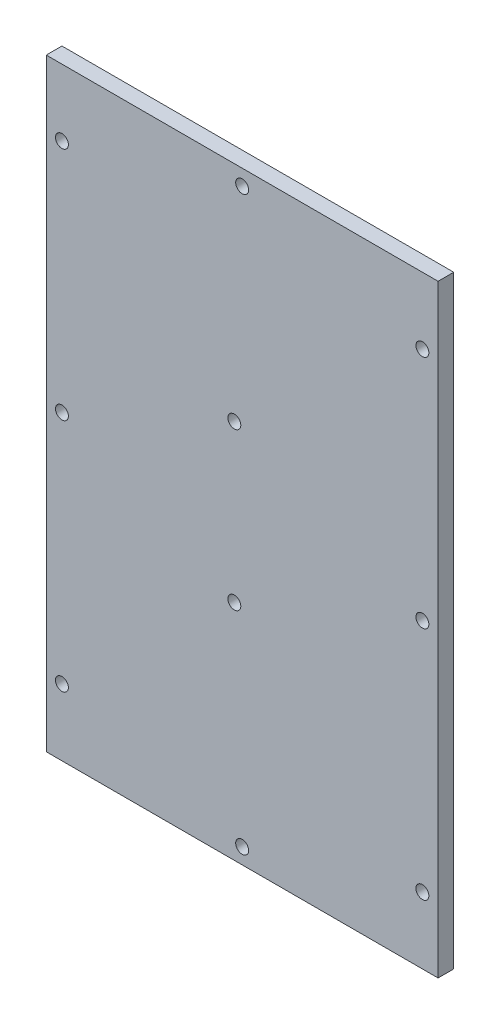
ISO-10303-21;
HEADER;
FILE_DESCRIPTION(('STEP AP214'),'2;1');
FILE_NAME('part.step','',(''),(''),'','','');
FILE_SCHEMA(('AUTOMOTIVE_DESIGN { 1 0 10303 214 1 1 1 1 }'));
ENDSEC;
DATA;
#1=APPLICATION_CONTEXT('core data for automotive mechanical design processes');
#2=APPLICATION_PROTOCOL_DEFINITION('international standard','automotive_design',2000,#1);
#3=PRODUCT_CONTEXT('',#1,'mechanical');
#4=PRODUCT('Part','Part','',(#3));
#5=PRODUCT_RELATED_PRODUCT_CATEGORY('part','',(#4));
#6=PRODUCT_DEFINITION_FORMATION('','',#4);
#7=PRODUCT_DEFINITION_CONTEXT('part definition',#1,'design');
#8=PRODUCT_DEFINITION('design','',#6,#7);
#9=PRODUCT_DEFINITION_SHAPE('','',#8);
#10=(LENGTH_UNIT() NAMED_UNIT(*) SI_UNIT(.MILLI.,.METRE.));
#11=(NAMED_UNIT(*) PLANE_ANGLE_UNIT() SI_UNIT($,.RADIAN.));
#12=(NAMED_UNIT(*) SI_UNIT($,.STERADIAN.) SOLID_ANGLE_UNIT());
#13=UNCERTAINTY_MEASURE_WITH_UNIT(LENGTH_MEASURE(1.E-05),#10,'distance_accuracy_value','');
#14=(GEOMETRIC_REPRESENTATION_CONTEXT(3) GLOBAL_UNCERTAINTY_ASSIGNED_CONTEXT((#13)) GLOBAL_UNIT_ASSIGNED_CONTEXT((#10,
#11,#12)) REPRESENTATION_CONTEXT('',''));
#15=CARTESIAN_POINT('',(0.,0.,0.));
#16=DIRECTION('',(0.,0.,1.));
#17=DIRECTION('',(1.,0.,0.));
#18=AXIS2_PLACEMENT_3D('',#15,#16,#17);
#19=CARTESIAN_POINT('',(-3.99999999999999,77.,4.));
#20=DIRECTION('',(0.,0.,-1.));
#21=DIRECTION('',(-1.,0.,0.));
#22=AXIS2_PLACEMENT_3D('',#19,#20,#21);
#23=CYLINDRICAL_SURFACE('',#22,1.65);
#24=CARTESIAN_POINT('',(-3.99999999999999,77.,4.));
#25=DIRECTION('',(0.,0.,-1.));
#26=DIRECTION('',(-1.,0.,0.));
#27=AXIS2_PLACEMENT_3D('',#24,#25,#26);
#28=CIRCLE('',#27,1.65);
#29=CARTESIAN_POINT('',(-5.64999999999999,77.,4.));
#30=VERTEX_POINT('',#29);
#31=EDGE_CURVE('E115',#30,#30,#28,.T.);
#32=ORIENTED_EDGE('',*,*,#31,.F.);
#33=EDGE_LOOP('',(#32));
#34=FACE_BOUND('',#33,.T.);
#35=CARTESIAN_POINT('',(-3.99999999999999,77.,1.5));
#36=DIRECTION('',(0.,0.,-1.));
#37=DIRECTION('',(-1.,0.,0.));
#38=AXIS2_PLACEMENT_3D('',#35,#36,#37);
#39=CIRCLE('',#38,1.65);
#40=CARTESIAN_POINT('',(-5.64999999999999,77.,1.5));
#41=VERTEX_POINT('',#40);
#42=EDGE_CURVE('E43',#41,#41,#39,.F.);
#43=ORIENTED_EDGE('',*,*,#42,.F.);
#44=EDGE_LOOP('',(#43));
#45=FACE_BOUND('',#44,.T.);
#46=ADVANCED_FACE('F39',(#34,#45),#23,.F.);
#47=CARTESIAN_POINT('',(-96.,17.,4.));
#48=DIRECTION('',(0.,0.,-1.));
#49=DIRECTION('',(-1.,0.,0.));
#50=AXIS2_PLACEMENT_3D('',#47,#48,#49);
#51=CYLINDRICAL_SURFACE('',#50,1.65);
#52=CARTESIAN_POINT('',(-96.,17.,4.));
#53=DIRECTION('',(0.,0.,-1.));
#54=DIRECTION('',(-1.,0.,0.));
#55=AXIS2_PLACEMENT_3D('',#52,#53,#54);
#56=CIRCLE('',#55,1.65);
#57=CARTESIAN_POINT('',(-97.65,17.,4.));
#58=VERTEX_POINT('',#57);
#59=EDGE_CURVE('E176',#58,#58,#56,.T.);
#60=ORIENTED_EDGE('',*,*,#59,.F.);
#61=EDGE_LOOP('',(#60));
#62=FACE_BOUND('',#61,.T.);
#63=CARTESIAN_POINT('',(-96.,17.,1.5));
#64=DIRECTION('',(0.,0.,-1.));
#65=DIRECTION('',(-1.,0.,0.));
#66=AXIS2_PLACEMENT_3D('',#63,#64,#65);
#67=CIRCLE('',#66,1.65);
#68=CARTESIAN_POINT('',(-97.65,17.,1.5));
#69=VERTEX_POINT('',#68);
#70=EDGE_CURVE('E145',#69,#69,#67,.F.);
#71=ORIENTED_EDGE('',*,*,#70,.F.);
#72=EDGE_LOOP('',(#71));
#73=FACE_BOUND('',#72,.T.);
#74=ADVANCED_FACE('F203',(#62,#73),#51,.F.);
#75=CARTESIAN_POINT('',(-52.,97.,4.));
#76=DIRECTION('',(0.,0.,-1.));
#77=DIRECTION('',(-1.,0.,0.));
#78=AXIS2_PLACEMENT_3D('',#75,#76,#77);
#79=CYLINDRICAL_SURFACE('',#78,1.65);
#80=CARTESIAN_POINT('',(-52.,97.,4.));
#81=DIRECTION('',(0.,0.,-1.));
#82=DIRECTION('',(-1.,0.,0.));
#83=AXIS2_PLACEMENT_3D('',#80,#81,#82);
#84=CIRCLE('',#83,1.65);
#85=CARTESIAN_POINT('',(-53.65,97.,4.));
#86=VERTEX_POINT('',#85);
#87=EDGE_CURVE('E175',#86,#86,#84,.T.);
#88=ORIENTED_EDGE('',*,*,#87,.F.);
#89=EDGE_LOOP('',(#88));
#90=FACE_BOUND('',#89,.T.);
#91=CARTESIAN_POINT('',(-52.,97.,1.5));
#92=DIRECTION('',(0.,0.,-1.));
#93=DIRECTION('',(-1.,0.,0.));
#94=AXIS2_PLACEMENT_3D('',#91,#92,#93);
#95=CIRCLE('',#94,1.65);
#96=CARTESIAN_POINT('',(-53.65,97.,1.5));
#97=VERTEX_POINT('',#96);
#98=EDGE_CURVE('E142',#97,#97,#95,.F.);
#99=ORIENTED_EDGE('',*,*,#98,.F.);
#100=EDGE_LOOP('',(#99));
#101=FACE_BOUND('',#100,.T.);
#102=ADVANCED_FACE('F210',(#90,#101),#79,.F.);
#103=CARTESIAN_POINT('',(-52.,57.,4.));
#104=DIRECTION('',(0.,0.,-1.));
#105=DIRECTION('',(-1.,0.,0.));
#106=AXIS2_PLACEMENT_3D('',#103,#104,#105);
#107=CYLINDRICAL_SURFACE('',#106,1.65);
#108=CARTESIAN_POINT('',(-52.,57.,4.));
#109=DIRECTION('',(0.,0.,-1.));
#110=DIRECTION('',(-1.,0.,0.));
#111=AXIS2_PLACEMENT_3D('',#108,#109,#110);
#112=CIRCLE('',#111,1.65);
#113=CARTESIAN_POINT('',(-53.65,57.,4.));
#114=VERTEX_POINT('',#113);
#115=EDGE_CURVE('E166',#114,#114,#112,.T.);
#116=ORIENTED_EDGE('',*,*,#115,.F.);
#117=EDGE_LOOP('',(#116));
#118=FACE_BOUND('',#117,.T.);
#119=CARTESIAN_POINT('',(-52.,57.,1.5));
#120=DIRECTION('',(0.,0.,-1.));
#121=DIRECTION('',(-1.,0.,0.));
#122=AXIS2_PLACEMENT_3D('',#119,#120,#121);
#123=CIRCLE('',#122,1.65);
#124=CARTESIAN_POINT('',(-53.65,57.,1.5));
#125=VERTEX_POINT('',#124);
#126=EDGE_CURVE('E137',#125,#125,#123,.F.);
#127=ORIENTED_EDGE('',*,*,#126,.F.);
#128=EDGE_LOOP('',(#127));
#129=FACE_BOUND('',#128,.T.);
#130=ADVANCED_FACE('F301',(#118,#129),#107,.F.);
#131=CARTESIAN_POINT('',(-50.,4.,4.));
#132=DIRECTION('',(0.,0.,-1.));
#133=DIRECTION('',(-1.,0.,0.));
#134=AXIS2_PLACEMENT_3D('',#131,#132,#133);
#135=CYLINDRICAL_SURFACE('',#134,1.65);
#136=CARTESIAN_POINT('',(-50.,4.,4.));
#137=DIRECTION('',(0.,0.,-1.));
#138=DIRECTION('',(-1.,0.,0.));
#139=AXIS2_PLACEMENT_3D('',#136,#137,#138);
#140=CIRCLE('',#139,1.65);
#141=CARTESIAN_POINT('',(-51.65,4.,4.));
#142=VERTEX_POINT('',#141);
#143=EDGE_CURVE('E173',#142,#142,#140,.T.);
#144=ORIENTED_EDGE('',*,*,#143,.F.);
#145=EDGE_LOOP('',(#144));
#146=FACE_BOUND('',#145,.T.);
#147=CARTESIAN_POINT('',(-50.,4.,1.5));
#148=DIRECTION('',(0.,0.,-1.));
#149=DIRECTION('',(-1.,0.,0.));
#150=AXIS2_PLACEMENT_3D('',#147,#148,#149);
#151=CIRCLE('',#150,1.65);
#152=CARTESIAN_POINT('',(-51.65,4.,1.5));
#153=VERTEX_POINT('',#152);
#154=EDGE_CURVE('E136',#153,#153,#151,.F.);
#155=ORIENTED_EDGE('',*,*,#154,.F.);
#156=EDGE_LOOP('',(#155));
#157=FACE_BOUND('',#156,.T.);
#158=ADVANCED_FACE('F302',(#146,#157),#135,.F.);
#159=CARTESIAN_POINT('',(-96.,77.,4.));
#160=DIRECTION('',(0.,0.,-1.));
#161=DIRECTION('',(-1.,0.,0.));
#162=AXIS2_PLACEMENT_3D('',#159,#160,#161);
#163=CYLINDRICAL_SURFACE('',#162,1.65);
#164=CARTESIAN_POINT('',(-96.,77.,4.));
#165=DIRECTION('',(0.,0.,-1.));
#166=DIRECTION('',(-1.,0.,0.));
#167=AXIS2_PLACEMENT_3D('',#164,#165,#166);
#168=CIRCLE('',#167,1.65);
#169=CARTESIAN_POINT('',(-97.65,77.,4.));
#170=VERTEX_POINT('',#169);
#171=EDGE_CURVE('E177',#170,#170,#168,.T.);
#172=ORIENTED_EDGE('',*,*,#171,.F.);
#173=EDGE_LOOP('',(#172));
#174=FACE_BOUND('',#173,.T.);
#175=CARTESIAN_POINT('',(-96.,77.,1.5));
#176=DIRECTION('',(0.,0.,-1.));
#177=DIRECTION('',(-1.,0.,0.));
#178=AXIS2_PLACEMENT_3D('',#175,#176,#177);
#179=CIRCLE('',#178,1.65);
#180=CARTESIAN_POINT('',(-97.65,77.,1.5));
#181=VERTEX_POINT('',#180);
#182=EDGE_CURVE('E133',#181,#181,#179,.F.);
#183=ORIENTED_EDGE('',*,*,#182,.F.);
#184=EDGE_LOOP('',(#183));
#185=FACE_BOUND('',#184,.T.);
#186=ADVANCED_FACE('F307',(#174,#185),#163,.F.);
#187=CARTESIAN_POINT('',(-96.,137.,4.));
#188=DIRECTION('',(0.,0.,-1.));
#189=DIRECTION('',(-1.,0.,0.));
#190=AXIS2_PLACEMENT_3D('',#187,#188,#189);
#191=CYLINDRICAL_SURFACE('',#190,1.65000000000001);
#192=CARTESIAN_POINT('',(-96.,137.,4.));
#193=DIRECTION('',(0.,0.,-1.));
#194=DIRECTION('',(-1.,0.,0.));
#195=AXIS2_PLACEMENT_3D('',#192,#193,#194);
#196=CIRCLE('',#195,1.65000000000001);
#197=CARTESIAN_POINT('',(-97.65,137.,4.));
#198=VERTEX_POINT('',#197);
#199=EDGE_CURVE('E188',#198,#198,#196,.T.);
#200=ORIENTED_EDGE('',*,*,#199,.F.);
#201=EDGE_LOOP('',(#200));
#202=FACE_BOUND('',#201,.T.);
#203=CARTESIAN_POINT('',(-96.,137.,1.5));
#204=DIRECTION('',(0.,0.,-1.));
#205=DIRECTION('',(-1.,0.,0.));
#206=AXIS2_PLACEMENT_3D('',#203,#204,#205);
#207=CIRCLE('',#206,1.65000000000001);
#208=CARTESIAN_POINT('',(-97.65,137.,1.5));
#209=VERTEX_POINT('',#208);
#210=EDGE_CURVE('E128',#209,#209,#207,.F.);
#211=ORIENTED_EDGE('',*,*,#210,.F.);
#212=EDGE_LOOP('',(#211));
#213=FACE_BOUND('',#212,.T.);
#214=ADVANCED_FACE('F312',(#202,#213),#191,.F.);
#215=CARTESIAN_POINT('',(-3.99999999999998,137.,4.));
#216=DIRECTION('',(0.,0.,-1.));
#217=DIRECTION('',(-1.,0.,0.));
#218=AXIS2_PLACEMENT_3D('',#215,#216,#217);
#219=CYLINDRICAL_SURFACE('',#218,1.65000000000001);
#220=CARTESIAN_POINT('',(-3.99999999999998,137.,4.));
#221=DIRECTION('',(0.,0.,-1.));
#222=DIRECTION('',(-1.,0.,0.));
#223=AXIS2_PLACEMENT_3D('',#220,#221,#222);
#224=CIRCLE('',#223,1.65000000000001);
#225=CARTESIAN_POINT('',(-5.64999999999999,137.,4.));
#226=VERTEX_POINT('',#225);
#227=EDGE_CURVE('E183',#226,#226,#224,.T.);
#228=ORIENTED_EDGE('',*,*,#227,.F.);
#229=EDGE_LOOP('',(#228));
#230=FACE_BOUND('',#229,.T.);
#231=CARTESIAN_POINT('',(-3.99999999999998,137.,1.5));
#232=DIRECTION('',(0.,0.,-1.));
#233=DIRECTION('',(-1.,0.,0.));
#234=AXIS2_PLACEMENT_3D('',#231,#232,#233);
#235=CIRCLE('',#234,1.65000000000001);
#236=CARTESIAN_POINT('',(-5.64999999999999,137.,1.5));
#237=VERTEX_POINT('',#236);
#238=EDGE_CURVE('E130',#237,#237,#235,.F.);
#239=ORIENTED_EDGE('',*,*,#238,.F.);
#240=EDGE_LOOP('',(#239));
#241=FACE_BOUND('',#240,.T.);
#242=ADVANCED_FACE('F242',(#230,#241),#219,.F.);
#243=CARTESIAN_POINT('',(-4.,17.,4.));
#244=DIRECTION('',(0.,0.,-1.));
#245=DIRECTION('',(-1.,0.,0.));
#246=AXIS2_PLACEMENT_3D('',#243,#244,#245);
#247=CYLINDRICAL_SURFACE('',#246,1.65);
#248=CARTESIAN_POINT('',(-4.,17.,4.));
#249=DIRECTION('',(0.,0.,-1.));
#250=DIRECTION('',(-1.,0.,0.));
#251=AXIS2_PLACEMENT_3D('',#248,#249,#250);
#252=CIRCLE('',#251,1.65);
#253=CARTESIAN_POINT('',(-5.65,17.,4.));
#254=VERTEX_POINT('',#253);
#255=EDGE_CURVE('E185',#254,#254,#252,.T.);
#256=ORIENTED_EDGE('',*,*,#255,.F.);
#257=EDGE_LOOP('',(#256));
#258=FACE_BOUND('',#257,.T.);
#259=CARTESIAN_POINT('',(-4.,17.,1.5));
#260=DIRECTION('',(0.,0.,-1.));
#261=DIRECTION('',(-1.,0.,0.));
#262=AXIS2_PLACEMENT_3D('',#259,#260,#261);
#263=CIRCLE('',#262,1.65);
#264=CARTESIAN_POINT('',(-5.65,17.,1.5));
#265=VERTEX_POINT('',#264);
#266=EDGE_CURVE('E123',#265,#265,#263,.F.);
#267=ORIENTED_EDGE('',*,*,#266,.F.);
#268=EDGE_LOOP('',(#267));
#269=FACE_BOUND('',#268,.T.);
#270=ADVANCED_FACE('F232',(#258,#269),#247,.F.);
#271=CARTESIAN_POINT('',(-50.,150.,4.));
#272=DIRECTION('',(0.,0.,-1.));
#273=DIRECTION('',(-1.,0.,0.));
#274=AXIS2_PLACEMENT_3D('',#271,#272,#273);
#275=CYLINDRICAL_SURFACE('',#274,1.65000000000001);
#276=CARTESIAN_POINT('',(-50.,150.,4.));
#277=DIRECTION('',(0.,0.,-1.));
#278=DIRECTION('',(-1.,0.,0.));
#279=AXIS2_PLACEMENT_3D('',#276,#277,#278);
#280=CIRCLE('',#279,1.65000000000001);
#281=CARTESIAN_POINT('',(-51.65,150.,4.));
#282=VERTEX_POINT('',#281);
#283=EDGE_CURVE('E169',#282,#282,#280,.T.);
#284=ORIENTED_EDGE('',*,*,#283,.F.);
#285=EDGE_LOOP('',(#284));
#286=FACE_BOUND('',#285,.T.);
#287=CARTESIAN_POINT('',(-50.,150.,1.5));
#288=DIRECTION('',(0.,0.,-1.));
#289=DIRECTION('',(-1.,0.,0.));
#290=AXIS2_PLACEMENT_3D('',#287,#288,#289);
#291=CIRCLE('',#290,1.65000000000001);
#292=CARTESIAN_POINT('',(-51.65,150.,1.5));
#293=VERTEX_POINT('',#292);
#294=EDGE_CURVE('E116',#293,#293,#291,.F.);
#295=ORIENTED_EDGE('',*,*,#294,.F.);
#296=EDGE_LOOP('',(#295));
#297=FACE_BOUND('',#296,.T.);
#298=ADVANCED_FACE('F215',(#286,#297),#275,.F.);
#299=CARTESIAN_POINT('',(0.,0.,4.));
#300=DIRECTION('',(0.,1.,0.));
#301=DIRECTION('',(0.,0.,1.));
#302=AXIS2_PLACEMENT_3D('',#299,#300,#301);
#303=PLANE('',#302);
#304=DIRECTION('',(1.,0.,0.));
#305=VECTOR('',#304,1.);
#306=CARTESIAN_POINT('',(0.,0.,0.));
#307=LINE('',#306,#305);
#308=CARTESIAN_POINT('',(-100.,0.,0.));
#309=VERTEX_POINT('',#308);
#310=CARTESIAN_POINT('',(0.,0.,0.));
#311=VERTEX_POINT('',#310);
#312=EDGE_CURVE('E108',#309,#311,#307,.T.);
#313=ORIENTED_EDGE('',*,*,#312,.T.);
#314=DIRECTION('',(0.,0.,-1.));
#315=VECTOR('',#314,1.);
#316=CARTESIAN_POINT('',(0.,0.,4.));
#317=LINE('',#316,#315);
#318=CARTESIAN_POINT('',(0.,0.,4.));
#319=VERTEX_POINT('',#318);
#320=EDGE_CURVE('E99',#319,#311,#317,.T.);
#321=ORIENTED_EDGE('',*,*,#320,.F.);
#322=DIRECTION('',(1.,0.,0.));
#323=VECTOR('',#322,1.);
#324=CARTESIAN_POINT('',(0.,0.,4.));
#325=LINE('',#324,#323);
#326=CARTESIAN_POINT('',(-100.,0.,4.));
#327=VERTEX_POINT('',#326);
#328=EDGE_CURVE('E94',#327,#319,#325,.T.);
#329=ORIENTED_EDGE('',*,*,#328,.F.);
#330=DIRECTION('',(0.,0.,-1.));
#331=VECTOR('',#330,1.);
#332=CARTESIAN_POINT('',(-100.,0.,4.));
#333=LINE('',#332,#331);
#334=EDGE_CURVE('E104',#327,#309,#333,.T.);
#335=ORIENTED_EDGE('',*,*,#334,.T.);
#336=EDGE_LOOP('',(#313,#321,#329,#335));
#337=FACE_BOUND('',#336,.T.);
#338=ADVANCED_FACE('F41',(#337),#303,.F.);
#339=CARTESIAN_POINT('',(0.,0.,4.));
#340=DIRECTION('',(-1.,0.,0.));
#341=DIRECTION('',(0.,0.,1.));
#342=AXIS2_PLACEMENT_3D('',#339,#340,#341);
#343=PLANE('',#342);
#344=DIRECTION('',(0.,1.,0.));
#345=VECTOR('',#344,1.);
#346=CARTESIAN_POINT('',(0.,0.,0.));
#347=LINE('',#346,#345);
#348=CARTESIAN_POINT('',(0.,154.,0.));
#349=VERTEX_POINT('',#348);
#350=EDGE_CURVE('E97',#311,#349,#347,.T.);
#351=ORIENTED_EDGE('',*,*,#350,.T.);
#352=DIRECTION('',(0.,0.,-1.));
#353=VECTOR('',#352,1.);
#354=CARTESIAN_POINT('',(0.,154.,4.));
#355=LINE('',#354,#353);
#356=CARTESIAN_POINT('',(0.,154.,4.));
#357=VERTEX_POINT('',#356);
#358=EDGE_CURVE('E100',#357,#349,#355,.T.);
#359=ORIENTED_EDGE('',*,*,#358,.F.);
#360=DIRECTION('',(0.,1.,0.));
#361=VECTOR('',#360,1.);
#362=CARTESIAN_POINT('',(0.,0.,4.));
#363=LINE('',#362,#361);
#364=EDGE_CURVE('E90',#319,#357,#363,.T.);
#365=ORIENTED_EDGE('',*,*,#364,.F.);
#366=ORIENTED_EDGE('',*,*,#320,.T.);
#367=EDGE_LOOP('',(#351,#359,#365,#366));
#368=FACE_BOUND('',#367,.T.);
#369=ADVANCED_FACE('F98',(#368),#343,.F.);
#370=CARTESIAN_POINT('',(0.,154.,4.));
#371=DIRECTION('',(0.,-1.,0.));
#372=DIRECTION('',(0.,0.,-1.));
#373=AXIS2_PLACEMENT_3D('',#370,#371,#372);
#374=PLANE('',#373);
#375=DIRECTION('',(-1.,0.,0.));
#376=VECTOR('',#375,1.);
#377=CARTESIAN_POINT('',(0.,154.,0.));
#378=LINE('',#377,#376);
#379=CARTESIAN_POINT('',(-100.,154.,0.));
#380=VERTEX_POINT('',#379);
#381=EDGE_CURVE('E73',#349,#380,#378,.T.);
#382=ORIENTED_EDGE('',*,*,#381,.T.);
#383=DIRECTION('',(0.,0.,-1.));
#384=VECTOR('',#383,1.);
#385=CARTESIAN_POINT('',(-100.,154.,4.));
#386=LINE('',#385,#384);
#387=CARTESIAN_POINT('',(-100.,154.,4.));
#388=VERTEX_POINT('',#387);
#389=EDGE_CURVE('E101',#388,#380,#386,.T.);
#390=ORIENTED_EDGE('',*,*,#389,.F.);
#391=DIRECTION('',(-1.,0.,0.));
#392=VECTOR('',#391,1.);
#393=CARTESIAN_POINT('',(0.,154.,4.));
#394=LINE('',#393,#392);
#395=EDGE_CURVE('E95',#357,#388,#394,.T.);
#396=ORIENTED_EDGE('',*,*,#395,.F.);
#397=ORIENTED_EDGE('',*,*,#358,.T.);
#398=EDGE_LOOP('',(#382,#390,#396,#397));
#399=FACE_BOUND('',#398,.T.);
#400=ADVANCED_FACE('F103',(#399),#374,.F.);
#401=CARTESIAN_POINT('',(-100.,0.,4.));
#402=DIRECTION('',(1.,0.,0.));
#403=DIRECTION('',(0.,0.,-1.));
#404=AXIS2_PLACEMENT_3D('',#401,#402,#403);
#405=PLANE('',#404);
#406=DIRECTION('',(0.,-1.,0.));
#407=VECTOR('',#406,1.);
#408=CARTESIAN_POINT('',(-100.,0.,0.));
#409=LINE('',#408,#407);
#410=EDGE_CURVE('E81',#380,#309,#409,.T.);
#411=ORIENTED_EDGE('',*,*,#410,.T.);
#412=ORIENTED_EDGE('',*,*,#334,.F.);
#413=DIRECTION('',(0.,-1.,0.));
#414=VECTOR('',#413,1.);
#415=CARTESIAN_POINT('',(-100.,0.,4.));
#416=LINE('',#415,#414);
#417=EDGE_CURVE('E59',#388,#327,#416,.T.);
#418=ORIENTED_EDGE('',*,*,#417,.F.);
#419=ORIENTED_EDGE('',*,*,#389,.T.);
#420=EDGE_LOOP('',(#411,#412,#418,#419));
#421=FACE_BOUND('',#420,.T.);
#422=ADVANCED_FACE('F220',(#421),#405,.F.);
#423=CARTESIAN_POINT('',(0.,0.,4.));
#424=DIRECTION('',(0.,0.,-1.));
#425=DIRECTION('',(-1.,0.,0.));
#426=AXIS2_PLACEMENT_3D('',#423,#424,#425);
#427=PLANE('',#426);
#428=ORIENTED_EDGE('',*,*,#283,.T.);
#429=EDGE_LOOP('',(#428));
#430=FACE_BOUND('',#429,.T.);
#431=ORIENTED_EDGE('',*,*,#255,.T.);
#432=EDGE_LOOP('',(#431));
#433=FACE_BOUND('',#432,.T.);
#434=ORIENTED_EDGE('',*,*,#227,.T.);
#435=EDGE_LOOP('',(#434));
#436=FACE_BOUND('',#435,.T.);
#437=ORIENTED_EDGE('',*,*,#199,.T.);
#438=EDGE_LOOP('',(#437));
#439=FACE_BOUND('',#438,.T.);
#440=ORIENTED_EDGE('',*,*,#171,.T.);
#441=EDGE_LOOP('',(#440));
#442=FACE_BOUND('',#441,.T.);
#443=ORIENTED_EDGE('',*,*,#143,.T.);
#444=EDGE_LOOP('',(#443));
#445=FACE_BOUND('',#444,.T.);
#446=ORIENTED_EDGE('',*,*,#115,.T.);
#447=EDGE_LOOP('',(#446));
#448=FACE_BOUND('',#447,.T.);
#449=ORIENTED_EDGE('',*,*,#87,.T.);
#450=EDGE_LOOP('',(#449));
#451=FACE_BOUND('',#450,.T.);
#452=ORIENTED_EDGE('',*,*,#59,.T.);
#453=EDGE_LOOP('',(#452));
#454=FACE_BOUND('',#453,.T.);
#455=ORIENTED_EDGE('',*,*,#31,.T.);
#456=EDGE_LOOP('',(#455));
#457=FACE_BOUND('',#456,.T.);
#458=ORIENTED_EDGE('',*,*,#328,.T.);
#459=ORIENTED_EDGE('',*,*,#364,.T.);
#460=ORIENTED_EDGE('',*,*,#395,.T.);
#461=ORIENTED_EDGE('',*,*,#417,.T.);
#462=EDGE_LOOP('',(#458,#459,#460,#461));
#463=FACE_BOUND('',#462,.T.);
#464=ADVANCED_FACE('F89',(#430,#433,#436,#439,#442,#445,#448,#451,#454,#457,#463),#427,.F.);
#465=CARTESIAN_POINT('',(0.,0.,0.));
#466=DIRECTION('',(0.,0.,-1.));
#467=DIRECTION('',(-1.,0.,0.));
#468=AXIS2_PLACEMENT_3D('',#465,#466,#467);
#469=PLANE('',#468);
#470=CARTESIAN_POINT('',(-50.,150.,0.));
#471=DIRECTION('',(0.,0.,-1.));
#472=DIRECTION('',(-1.,0.,0.));
#473=AXIS2_PLACEMENT_3D('',#470,#471,#472);
#474=CIRCLE('',#473,3.);
#475=CARTESIAN_POINT('',(-53.,150.,0.));
#476=VERTEX_POINT('',#475);
#477=EDGE_CURVE('E371',#476,#476,#474,.T.);
#478=ORIENTED_EDGE('',*,*,#477,.F.);
#479=EDGE_LOOP('',(#478));
#480=FACE_BOUND('',#479,.T.);
#481=CARTESIAN_POINT('',(-4.,17.,0.));
#482=DIRECTION('',(0.,0.,-1.));
#483=DIRECTION('',(-1.,0.,0.));
#484=AXIS2_PLACEMENT_3D('',#481,#482,#483);
#485=CIRCLE('',#484,3.);
#486=CARTESIAN_POINT('',(-7.,17.,0.));
#487=VERTEX_POINT('',#486);
#488=EDGE_CURVE('E385',#487,#487,#485,.T.);
#489=ORIENTED_EDGE('',*,*,#488,.F.);
#490=EDGE_LOOP('',(#489));
#491=FACE_BOUND('',#490,.T.);
#492=CARTESIAN_POINT('',(-3.99999999999999,77.,0.));
#493=DIRECTION('',(0.,0.,-1.));
#494=DIRECTION('',(-1.,0.,0.));
#495=AXIS2_PLACEMENT_3D('',#492,#493,#494);
#496=CIRCLE('',#495,3.);
#497=CARTESIAN_POINT('',(-6.99999999999999,77.,0.));
#498=VERTEX_POINT('',#497);
#499=EDGE_CURVE('E403',#498,#498,#496,.T.);
#500=ORIENTED_EDGE('',*,*,#499,.F.);
#501=EDGE_LOOP('',(#500));
#502=FACE_BOUND('',#501,.T.);
#503=CARTESIAN_POINT('',(-96.,77.,0.));
#504=DIRECTION('',(0.,0.,-1.));
#505=DIRECTION('',(-1.,0.,0.));
#506=AXIS2_PLACEMENT_3D('',#503,#504,#505);
#507=CIRCLE('',#506,3.00000000000001);
#508=CARTESIAN_POINT('',(-99.,77.,0.));
#509=VERTEX_POINT('',#508);
#510=EDGE_CURVE('E418',#509,#509,#507,.T.);
#511=ORIENTED_EDGE('',*,*,#510,.F.);
#512=EDGE_LOOP('',(#511));
#513=FACE_BOUND('',#512,.T.);
#514=CARTESIAN_POINT('',(-96.,137.,0.));
#515=DIRECTION('',(0.,0.,-1.));
#516=DIRECTION('',(-1.,0.,0.));
#517=AXIS2_PLACEMENT_3D('',#514,#515,#516);
#518=CIRCLE('',#517,3.00000000000001);
#519=CARTESIAN_POINT('',(-99.,137.,0.));
#520=VERTEX_POINT('',#519);
#521=EDGE_CURVE('E359',#520,#520,#518,.T.);
#522=ORIENTED_EDGE('',*,*,#521,.F.);
#523=EDGE_LOOP('',(#522));
#524=FACE_BOUND('',#523,.T.);
#525=CARTESIAN_POINT('',(-52.,97.,0.));
#526=DIRECTION('',(0.,0.,-1.));
#527=DIRECTION('',(-1.,0.,0.));
#528=AXIS2_PLACEMENT_3D('',#525,#526,#527);
#529=CIRCLE('',#528,3.);
#530=CARTESIAN_POINT('',(-55.,97.,0.));
#531=VERTEX_POINT('',#530);
#532=EDGE_CURVE('E428',#531,#531,#529,.T.);
#533=ORIENTED_EDGE('',*,*,#532,.F.);
#534=EDGE_LOOP('',(#533));
#535=FACE_BOUND('',#534,.T.);
#536=CARTESIAN_POINT('',(-50.,4.,0.));
#537=DIRECTION('',(0.,0.,-1.));
#538=DIRECTION('',(-1.,0.,0.));
#539=AXIS2_PLACEMENT_3D('',#536,#537,#538);
#540=CIRCLE('',#539,3.);
#541=CARTESIAN_POINT('',(-53.,4.,0.));
#542=VERTEX_POINT('',#541);
#543=EDGE_CURVE('E435',#542,#542,#540,.T.);
#544=ORIENTED_EDGE('',*,*,#543,.F.);
#545=EDGE_LOOP('',(#544));
#546=FACE_BOUND('',#545,.T.);
#547=CARTESIAN_POINT('',(-52.,57.,0.));
#548=DIRECTION('',(0.,0.,-1.));
#549=DIRECTION('',(-1.,0.,0.));
#550=AXIS2_PLACEMENT_3D('',#547,#548,#549);
#551=CIRCLE('',#550,3.);
#552=CARTESIAN_POINT('',(-55.,57.,0.));
#553=VERTEX_POINT('',#552);
#554=EDGE_CURVE('E436',#553,#553,#551,.T.);
#555=ORIENTED_EDGE('',*,*,#554,.F.);
#556=EDGE_LOOP('',(#555));
#557=FACE_BOUND('',#556,.T.);
#558=CARTESIAN_POINT('',(-3.99999999999998,137.,0.));
#559=DIRECTION('',(0.,0.,-1.));
#560=DIRECTION('',(-1.,0.,0.));
#561=AXIS2_PLACEMENT_3D('',#558,#559,#560);
#562=CIRCLE('',#561,3.);
#563=CARTESIAN_POINT('',(-6.99999999999999,137.,0.));
#564=VERTEX_POINT('',#563);
#565=EDGE_CURVE('E363',#564,#564,#562,.T.);
#566=ORIENTED_EDGE('',*,*,#565,.F.);
#567=EDGE_LOOP('',(#566));
#568=FACE_BOUND('',#567,.T.);
#569=CARTESIAN_POINT('',(-96.,17.,0.));
#570=DIRECTION('',(0.,0.,-1.));
#571=DIRECTION('',(-1.,0.,0.));
#572=AXIS2_PLACEMENT_3D('',#569,#570,#571);
#573=CIRCLE('',#572,3.00000000000001);
#574=CARTESIAN_POINT('',(-99.,17.,0.));
#575=VERTEX_POINT('',#574);
#576=EDGE_CURVE('E377',#575,#575,#573,.T.);
#577=ORIENTED_EDGE('',*,*,#576,.F.);
#578=EDGE_LOOP('',(#577));
#579=FACE_BOUND('',#578,.T.);
#580=CARTESIAN_POINT('',(-85.,139.,0.));
#581=DIRECTION('',(0.,0.,-1.));
#582=DIRECTION('',(-1.,0.,0.));
#583=AXIS2_PLACEMENT_3D('',#580,#581,#582);
#584=CIRCLE('',#583,7.50000000000001);
#585=CARTESIAN_POINT('',(-92.5,139.,0.));
#586=VERTEX_POINT('',#585);
#587=EDGE_CURVE('E11',#586,#586,#584,.T.);
#588=ORIENTED_EDGE('',*,*,#587,.F.);
#589=EDGE_LOOP('',(#588));
#590=FACE_BOUND('',#589,.T.);
#591=CARTESIAN_POINT('',(-15.,139.,0.));
#592=DIRECTION('',(0.,0.,-1.));
#593=DIRECTION('',(-1.,0.,0.));
#594=AXIS2_PLACEMENT_3D('',#591,#592,#593);
#595=CIRCLE('',#594,7.5);
#596=CARTESIAN_POINT('',(-22.5,139.,0.));
#597=VERTEX_POINT('',#596);
#598=EDGE_CURVE('E47',#597,#597,#595,.T.);
#599=ORIENTED_EDGE('',*,*,#598,.F.);
#600=EDGE_LOOP('',(#599));
#601=FACE_BOUND('',#600,.T.);
#602=CARTESIAN_POINT('',(-15.,15.,0.));
#603=DIRECTION('',(0.,0.,-1.));
#604=DIRECTION('',(-1.,0.,0.));
#605=AXIS2_PLACEMENT_3D('',#602,#603,#604);
#606=CIRCLE('',#605,7.5);
#607=CARTESIAN_POINT('',(-22.5,15.,0.));
#608=VERTEX_POINT('',#607);
#609=EDGE_CURVE('E163',#608,#608,#606,.T.);
#610=ORIENTED_EDGE('',*,*,#609,.F.);
#611=EDGE_LOOP('',(#610));
#612=FACE_BOUND('',#611,.T.);
#613=CARTESIAN_POINT('',(-85.,15.,0.));
#614=DIRECTION('',(0.,0.,-1.));
#615=DIRECTION('',(-1.,0.,0.));
#616=AXIS2_PLACEMENT_3D('',#613,#614,#615);
#617=CIRCLE('',#616,7.5);
#618=CARTESIAN_POINT('',(-92.5,15.,0.));
#619=VERTEX_POINT('',#618);
#620=EDGE_CURVE('E119',#619,#619,#617,.T.);
#621=ORIENTED_EDGE('',*,*,#620,.F.);
#622=EDGE_LOOP('',(#621));
#623=FACE_BOUND('',#622,.T.);
#624=ORIENTED_EDGE('',*,*,#312,.F.);
#625=ORIENTED_EDGE('',*,*,#410,.F.);
#626=ORIENTED_EDGE('',*,*,#381,.F.);
#627=ORIENTED_EDGE('',*,*,#350,.F.);
#628=EDGE_LOOP('',(#624,#625,#626,#627));
#629=FACE_BOUND('',#628,.T.);
#630=ADVANCED_FACE('F216',(#480,#491,#502,#513,#524,#535,#546,#557,#568,#579,#590,#601,#612,
#623,#629),#469,.T.);
#631=CARTESIAN_POINT('',(-85.,15.,0.));
#632=DIRECTION('',(0.,0.,1.));
#633=DIRECTION('',(-1.,0.,0.));
#634=AXIS2_PLACEMENT_3D('',#631,#632,#633);
#635=CONICAL_SURFACE('',#634,7.5,0.26179938779915);
#636=CARTESIAN_POINT('',(-85.,15.,-6.));
#637=DIRECTION('',(0.,0.,-1.));
#638=DIRECTION('',(-1.,0.,0.));
#639=AXIS2_PLACEMENT_3D('',#636,#637,#638);
#640=CIRCLE('',#639,5.89230484541326);
#641=CARTESIAN_POINT('',(-90.8923048454133,15.,-6.));
#642=VERTEX_POINT('',#641);
#643=EDGE_CURVE('E164',#642,#642,#640,.T.);
#644=ORIENTED_EDGE('',*,*,#643,.F.);
#645=EDGE_LOOP('',(#644));
#646=FACE_BOUND('',#645,.T.);
#647=ORIENTED_EDGE('',*,*,#620,.T.);
#648=EDGE_LOOP('',(#647));
#649=FACE_BOUND('',#648,.T.);
#650=ADVANCED_FACE('F222',(#646,#649),#635,.T.);
#651=CARTESIAN_POINT('',(-85.,15.,-6.));
#652=DIRECTION('',(0.,0.,-1.));
#653=DIRECTION('',(-1.,0.,0.));
#654=AXIS2_PLACEMENT_3D('',#651,#652,#653);
#655=PLANE('',#654);
#656=ORIENTED_EDGE('',*,*,#643,.T.);
#657=EDGE_LOOP('',(#656));
#658=FACE_BOUND('',#657,.T.);
#659=ADVANCED_FACE('F276',(#658),#655,.T.);
#660=CARTESIAN_POINT('',(-15.,15.,0.));
#661=DIRECTION('',(0.,0.,1.));
#662=DIRECTION('',(-1.,0.,0.));
#663=AXIS2_PLACEMENT_3D('',#660,#661,#662);
#664=CONICAL_SURFACE('',#663,7.5,0.26179938779915);
#665=CARTESIAN_POINT('',(-15.,15.,-6.));
#666=DIRECTION('',(0.,0.,-1.));
#667=DIRECTION('',(-1.,0.,0.));
#668=AXIS2_PLACEMENT_3D('',#665,#666,#667);
#669=CIRCLE('',#668,5.89230484541326);
#670=CARTESIAN_POINT('',(-20.8923048454133,15.,-6.));
#671=VERTEX_POINT('',#670);
#672=EDGE_CURVE('E158',#671,#671,#669,.T.);
#673=ORIENTED_EDGE('',*,*,#672,.F.);
#674=EDGE_LOOP('',(#673));
#675=FACE_BOUND('',#674,.T.);
#676=ORIENTED_EDGE('',*,*,#609,.T.);
#677=EDGE_LOOP('',(#676));
#678=FACE_BOUND('',#677,.T.);
#679=ADVANCED_FACE('F274',(#675,#678),#664,.T.);
#680=CARTESIAN_POINT('',(-15.,15.,-6.));
#681=DIRECTION('',(0.,0.,-1.));
#682=DIRECTION('',(-1.,0.,0.));
#683=AXIS2_PLACEMENT_3D('',#680,#681,#682);
#684=PLANE('',#683);
#685=ORIENTED_EDGE('',*,*,#672,.T.);
#686=EDGE_LOOP('',(#685));
#687=FACE_BOUND('',#686,.T.);
#688=ADVANCED_FACE('F279',(#687),#684,.T.);
#689=CARTESIAN_POINT('',(-15.,139.,0.));
#690=DIRECTION('',(0.,0.,1.));
#691=DIRECTION('',(-1.,0.,0.));
#692=AXIS2_PLACEMENT_3D('',#689,#690,#691);
#693=CONICAL_SURFACE('',#692,7.5,0.26179938779915);
#694=CARTESIAN_POINT('',(-15.,139.,-6.));
#695=DIRECTION('',(0.,0.,-1.));
#696=DIRECTION('',(-1.,0.,0.));
#697=AXIS2_PLACEMENT_3D('',#694,#695,#696);
#698=CIRCLE('',#697,5.89230484541326);
#699=CARTESIAN_POINT('',(-20.8923048454132,139.,-6.));
#700=VERTEX_POINT('',#699);
#701=EDGE_CURVE('E153',#700,#700,#698,.T.);
#702=ORIENTED_EDGE('',*,*,#701,.F.);
#703=EDGE_LOOP('',(#702));
#704=FACE_BOUND('',#703,.T.);
#705=ORIENTED_EDGE('',*,*,#598,.T.);
#706=EDGE_LOOP('',(#705));
#707=FACE_BOUND('',#706,.T.);
#708=ADVANCED_FACE('F283',(#704,#707),#693,.T.);
#709=CARTESIAN_POINT('',(-15.,139.,-6.));
#710=DIRECTION('',(0.,0.,-1.));
#711=DIRECTION('',(-1.,0.,0.));
#712=AXIS2_PLACEMENT_3D('',#709,#710,#711);
#713=PLANE('',#712);
#714=ORIENTED_EDGE('',*,*,#701,.T.);
#715=EDGE_LOOP('',(#714));
#716=FACE_BOUND('',#715,.T.);
#717=ADVANCED_FACE('F290',(#716),#713,.T.);
#718=CARTESIAN_POINT('',(-85.,139.,0.));
#719=DIRECTION('',(0.,0.,1.));
#720=DIRECTION('',(-1.,0.,0.));
#721=AXIS2_PLACEMENT_3D('',#718,#719,#720);
#722=CONICAL_SURFACE('',#721,7.50000000000001,0.26179938779915);
#723=CARTESIAN_POINT('',(-85.,139.,-6.));
#724=DIRECTION('',(0.,0.,-1.));
#725=DIRECTION('',(-1.,0.,0.));
#726=AXIS2_PLACEMENT_3D('',#723,#724,#725);
#727=CIRCLE('',#726,5.89230484541327);
#728=CARTESIAN_POINT('',(-90.8923048454133,139.,-6.));
#729=VERTEX_POINT('',#728);
#730=EDGE_CURVE('E149',#729,#729,#727,.T.);
#731=ORIENTED_EDGE('',*,*,#730,.F.);
#732=EDGE_LOOP('',(#731));
#733=FACE_BOUND('',#732,.T.);
#734=ORIENTED_EDGE('',*,*,#587,.T.);
#735=EDGE_LOOP('',(#734));
#736=FACE_BOUND('',#735,.T.);
#737=ADVANCED_FACE('F257',(#733,#736),#722,.T.);
#738=CARTESIAN_POINT('',(-85.,139.,-6.));
#739=DIRECTION('',(0.,0.,-1.));
#740=DIRECTION('',(-1.,0.,0.));
#741=AXIS2_PLACEMENT_3D('',#738,#739,#740);
#742=PLANE('',#741);
#743=ORIENTED_EDGE('',*,*,#730,.T.);
#744=EDGE_LOOP('',(#743));
#745=FACE_BOUND('',#744,.T.);
#746=ADVANCED_FACE('F253',(#745),#742,.T.);
#747=CARTESIAN_POINT('',(-50.,150.,1.5));
#748=DIRECTION('',(0.,0.,-1.));
#749=DIRECTION('',(-1.,0.,0.));
#750=AXIS2_PLACEMENT_3D('',#747,#748,#749);
#751=PLANE('',#750);
#752=CARTESIAN_POINT('',(-50.,150.,1.5));
#753=DIRECTION('',(0.,0.,-1.));
#754=DIRECTION('',(-1.,0.,0.));
#755=AXIS2_PLACEMENT_3D('',#752,#753,#754);
#756=CIRCLE('',#755,3.);
#757=CARTESIAN_POINT('',(-53.,150.,1.5));
#758=VERTEX_POINT('',#757);
#759=EDGE_CURVE('E374',#758,#758,#756,.T.);
#760=ORIENTED_EDGE('',*,*,#759,.T.);
#761=EDGE_LOOP('',(#760));
#762=FACE_BOUND('',#761,.T.);
#763=ORIENTED_EDGE('',*,*,#294,.T.);
#764=EDGE_LOOP('',(#763));
#765=FACE_BOUND('',#764,.T.);
#766=ADVANCED_FACE('F248',(#762,#765),#751,.T.);
#767=CARTESIAN_POINT('',(-50.,150.,1.5));
#768=DIRECTION('',(0.,0.,-1.));
#769=DIRECTION('',(-1.,0.,0.));
#770=AXIS2_PLACEMENT_3D('',#767,#768,#769);
#771=CYLINDRICAL_SURFACE('',#770,3.);
#772=ORIENTED_EDGE('',*,*,#759,.F.);
#773=EDGE_LOOP('',(#772));
#774=FACE_BOUND('',#773,.T.);
#775=ORIENTED_EDGE('',*,*,#477,.T.);
#776=EDGE_LOOP('',(#775));
#777=FACE_BOUND('',#776,.T.);
#778=ADVANCED_FACE('F249',(#774,#777),#771,.F.);
#779=CARTESIAN_POINT('',(-4.,17.,1.5));
#780=DIRECTION('',(0.,0.,-1.));
#781=DIRECTION('',(-1.,0.,0.));
#782=AXIS2_PLACEMENT_3D('',#779,#780,#781);
#783=PLANE('',#782);
#784=CARTESIAN_POINT('',(-4.,17.,1.5));
#785=DIRECTION('',(0.,0.,-1.));
#786=DIRECTION('',(-1.,0.,0.));
#787=AXIS2_PLACEMENT_3D('',#784,#785,#786);
#788=CIRCLE('',#787,3.);
#789=CARTESIAN_POINT('',(-7.,17.,1.5));
#790=VERTEX_POINT('',#789);
#791=EDGE_CURVE('E399',#790,#790,#788,.T.);
#792=ORIENTED_EDGE('',*,*,#791,.T.);
#793=EDGE_LOOP('',(#792));
#794=FACE_BOUND('',#793,.T.);
#795=ORIENTED_EDGE('',*,*,#266,.T.);
#796=EDGE_LOOP('',(#795));
#797=FACE_BOUND('',#796,.T.);
#798=ADVANCED_FACE('F260',(#794,#797),#783,.T.);
#799=CARTESIAN_POINT('',(-4.,17.,1.5));
#800=DIRECTION('',(0.,0.,-1.));
#801=DIRECTION('',(-1.,0.,0.));
#802=AXIS2_PLACEMENT_3D('',#799,#800,#801);
#803=CYLINDRICAL_SURFACE('',#802,3.);
#804=ORIENTED_EDGE('',*,*,#791,.F.);
#805=EDGE_LOOP('',(#804));
#806=FACE_BOUND('',#805,.T.);
#807=ORIENTED_EDGE('',*,*,#488,.T.);
#808=EDGE_LOOP('',(#807));
#809=FACE_BOUND('',#808,.T.);
#810=ADVANCED_FACE('F477',(#806,#809),#803,.F.);
#811=CARTESIAN_POINT('',(-3.99999999999998,137.,1.5));
#812=DIRECTION('',(0.,0.,-1.));
#813=DIRECTION('',(-1.,0.,0.));
#814=AXIS2_PLACEMENT_3D('',#811,#812,#813);
#815=PLANE('',#814);
#816=CARTESIAN_POINT('',(-3.99999999999998,137.,1.5));
#817=DIRECTION('',(0.,0.,-1.));
#818=DIRECTION('',(-1.,0.,0.));
#819=AXIS2_PLACEMENT_3D('',#816,#817,#818);
#820=CIRCLE('',#819,3.);
#821=CARTESIAN_POINT('',(-6.99999999999999,137.,1.5));
#822=VERTEX_POINT('',#821);
#823=EDGE_CURVE('E370',#822,#822,#820,.T.);
#824=ORIENTED_EDGE('',*,*,#823,.T.);
#825=EDGE_LOOP('',(#824));
#826=FACE_BOUND('',#825,.T.);
#827=ORIENTED_EDGE('',*,*,#238,.T.);
#828=EDGE_LOOP('',(#827));
#829=FACE_BOUND('',#828,.T.);
#830=ADVANCED_FACE('F352',(#826,#829),#815,.T.);
#831=CARTESIAN_POINT('',(-3.99999999999998,137.,1.5));
#832=DIRECTION('',(0.,0.,-1.));
#833=DIRECTION('',(-1.,0.,0.));
#834=AXIS2_PLACEMENT_3D('',#831,#832,#833);
#835=CYLINDRICAL_SURFACE('',#834,3.);
#836=ORIENTED_EDGE('',*,*,#823,.F.);
#837=EDGE_LOOP('',(#836));
#838=FACE_BOUND('',#837,.T.);
#839=ORIENTED_EDGE('',*,*,#565,.T.);
#840=EDGE_LOOP('',(#839));
#841=FACE_BOUND('',#840,.T.);
#842=ADVANCED_FACE('F347',(#838,#841),#835,.F.);
#843=CARTESIAN_POINT('',(-96.,137.,1.5));
#844=DIRECTION('',(0.,0.,-1.));
#845=DIRECTION('',(-1.,0.,0.));
#846=AXIS2_PLACEMENT_3D('',#843,#844,#845);
#847=PLANE('',#846);
#848=CARTESIAN_POINT('',(-96.,137.,1.5));
#849=DIRECTION('',(0.,0.,-1.));
#850=DIRECTION('',(-1.,0.,0.));
#851=AXIS2_PLACEMENT_3D('',#848,#849,#850);
#852=CIRCLE('',#851,3.00000000000001);
#853=CARTESIAN_POINT('',(-99.,137.,1.5));
#854=VERTEX_POINT('',#853);
#855=EDGE_CURVE('E360',#854,#854,#852,.T.);
#856=ORIENTED_EDGE('',*,*,#855,.T.);
#857=EDGE_LOOP('',(#856));
#858=FACE_BOUND('',#857,.T.);
#859=ORIENTED_EDGE('',*,*,#210,.T.);
#860=EDGE_LOOP('',(#859));
#861=FACE_BOUND('',#860,.T.);
#862=ADVANCED_FACE('F336',(#858,#861),#847,.T.);
#863=CARTESIAN_POINT('',(-96.,137.,1.5));
#864=DIRECTION('',(0.,0.,-1.));
#865=DIRECTION('',(-1.,0.,0.));
#866=AXIS2_PLACEMENT_3D('',#863,#864,#865);
#867=CYLINDRICAL_SURFACE('',#866,3.00000000000001);
#868=ORIENTED_EDGE('',*,*,#855,.F.);
#869=EDGE_LOOP('',(#868));
#870=FACE_BOUND('',#869,.T.);
#871=ORIENTED_EDGE('',*,*,#521,.T.);
#872=EDGE_LOOP('',(#871));
#873=FACE_BOUND('',#872,.T.);
#874=ADVANCED_FACE('F329',(#870,#873),#867,.F.);
#875=CARTESIAN_POINT('',(-96.,77.,1.5));
#876=DIRECTION('',(0.,0.,-1.));
#877=DIRECTION('',(-1.,0.,0.));
#878=AXIS2_PLACEMENT_3D('',#875,#876,#877);
#879=PLANE('',#878);
#880=CARTESIAN_POINT('',(-96.,77.,1.5));
#881=DIRECTION('',(0.,0.,-1.));
#882=DIRECTION('',(-1.,0.,0.));
#883=AXIS2_PLACEMENT_3D('',#880,#881,#882);
#884=CIRCLE('',#883,3.00000000000001);
#885=CARTESIAN_POINT('',(-99.,77.,1.5));
#886=VERTEX_POINT('',#885);
#887=EDGE_CURVE('E365',#886,#886,#884,.T.);
#888=ORIENTED_EDGE('',*,*,#887,.T.);
#889=EDGE_LOOP('',(#888));
#890=FACE_BOUND('',#889,.T.);
#891=ORIENTED_EDGE('',*,*,#182,.T.);
#892=EDGE_LOOP('',(#891));
#893=FACE_BOUND('',#892,.T.);
#894=ADVANCED_FACE('F330',(#890,#893),#879,.T.);
#895=CARTESIAN_POINT('',(-96.,77.,1.5));
#896=DIRECTION('',(0.,0.,-1.));
#897=DIRECTION('',(-1.,0.,0.));
#898=AXIS2_PLACEMENT_3D('',#895,#896,#897);
#899=CYLINDRICAL_SURFACE('',#898,3.00000000000001);
#900=ORIENTED_EDGE('',*,*,#887,.F.);
#901=EDGE_LOOP('',(#900));
#902=FACE_BOUND('',#901,.T.);
#903=ORIENTED_EDGE('',*,*,#510,.T.);
#904=EDGE_LOOP('',(#903));
#905=FACE_BOUND('',#904,.T.);
#906=ADVANCED_FACE('F328',(#902,#905),#899,.F.);
#907=CARTESIAN_POINT('',(-50.,4.,1.5));
#908=DIRECTION('',(0.,0.,-1.));
#909=DIRECTION('',(-1.,0.,0.));
#910=AXIS2_PLACEMENT_3D('',#907,#908,#909);
#911=PLANE('',#910);
#912=CARTESIAN_POINT('',(-50.,4.,1.5));
#913=DIRECTION('',(0.,0.,-1.));
#914=DIRECTION('',(-1.,0.,0.));
#915=AXIS2_PLACEMENT_3D('',#912,#913,#914);
#916=CIRCLE('',#915,3.);
#917=CARTESIAN_POINT('',(-53.,4.,1.5));
#918=VERTEX_POINT('',#917);
#919=EDGE_CURVE('E451',#918,#918,#916,.T.);
#920=ORIENTED_EDGE('',*,*,#919,.T.);
#921=EDGE_LOOP('',(#920));
#922=FACE_BOUND('',#921,.T.);
#923=ORIENTED_EDGE('',*,*,#154,.T.);
#924=EDGE_LOOP('',(#923));
#925=FACE_BOUND('',#924,.T.);
#926=ADVANCED_FACE('F340',(#922,#925),#911,.T.);
#927=CARTESIAN_POINT('',(-50.,4.,1.5));
#928=DIRECTION('',(0.,0.,-1.));
#929=DIRECTION('',(-1.,0.,0.));
#930=AXIS2_PLACEMENT_3D('',#927,#928,#929);
#931=CYLINDRICAL_SURFACE('',#930,3.);
#932=ORIENTED_EDGE('',*,*,#919,.F.);
#933=EDGE_LOOP('',(#932));
#934=FACE_BOUND('',#933,.T.);
#935=ORIENTED_EDGE('',*,*,#543,.T.);
#936=EDGE_LOOP('',(#935));
#937=FACE_BOUND('',#936,.T.);
#938=ADVANCED_FACE('F454',(#934,#937),#931,.F.);
#939=CARTESIAN_POINT('',(-52.,57.,1.5));
#940=DIRECTION('',(0.,0.,-1.));
#941=DIRECTION('',(-1.,0.,0.));
#942=AXIS2_PLACEMENT_3D('',#939,#940,#941);
#943=PLANE('',#942);
#944=CARTESIAN_POINT('',(-52.,57.,1.5));
#945=DIRECTION('',(0.,0.,-1.));
#946=DIRECTION('',(-1.,0.,0.));
#947=AXIS2_PLACEMENT_3D('',#944,#945,#946);
#948=CIRCLE('',#947,3.);
#949=CARTESIAN_POINT('',(-55.,57.,1.5));
#950=VERTEX_POINT('',#949);
#951=EDGE_CURVE('E408',#950,#950,#948,.T.);
#952=ORIENTED_EDGE('',*,*,#951,.T.);
#953=EDGE_LOOP('',(#952));
#954=FACE_BOUND('',#953,.T.);
#955=ORIENTED_EDGE('',*,*,#126,.T.);
#956=EDGE_LOOP('',(#955));
#957=FACE_BOUND('',#956,.T.);
#958=ADVANCED_FACE('F460',(#954,#957),#943,.T.);
#959=CARTESIAN_POINT('',(-52.,57.,1.5));
#960=DIRECTION('',(0.,0.,-1.));
#961=DIRECTION('',(-1.,0.,0.));
#962=AXIS2_PLACEMENT_3D('',#959,#960,#961);
#963=CYLINDRICAL_SURFACE('',#962,3.);
#964=ORIENTED_EDGE('',*,*,#951,.F.);
#965=EDGE_LOOP('',(#964));
#966=FACE_BOUND('',#965,.T.);
#967=ORIENTED_EDGE('',*,*,#554,.T.);
#968=EDGE_LOOP('',(#967));
#969=FACE_BOUND('',#968,.T.);
#970=ADVANCED_FACE('F464',(#966,#969),#963,.F.);
#971=CARTESIAN_POINT('',(-52.,97.,1.5));
#972=DIRECTION('',(0.,0.,-1.));
#973=DIRECTION('',(-1.,0.,0.));
#974=AXIS2_PLACEMENT_3D('',#971,#972,#973);
#975=PLANE('',#974);
#976=CARTESIAN_POINT('',(-52.,97.,1.5));
#977=DIRECTION('',(0.,0.,-1.));
#978=DIRECTION('',(-1.,0.,0.));
#979=AXIS2_PLACEMENT_3D('',#976,#977,#978);
#980=CIRCLE('',#979,3.);
#981=CARTESIAN_POINT('',(-55.,97.,1.5));
#982=VERTEX_POINT('',#981);
#983=EDGE_CURVE('E372',#982,#982,#980,.T.);
#984=ORIENTED_EDGE('',*,*,#983,.T.);
#985=EDGE_LOOP('',(#984));
#986=FACE_BOUND('',#985,.T.);
#987=ORIENTED_EDGE('',*,*,#98,.T.);
#988=EDGE_LOOP('',(#987));
#989=FACE_BOUND('',#988,.T.);
#990=ADVANCED_FACE('F471',(#986,#989),#975,.T.);
#991=CARTESIAN_POINT('',(-52.,97.,1.5));
#992=DIRECTION('',(0.,0.,-1.));
#993=DIRECTION('',(-1.,0.,0.));
#994=AXIS2_PLACEMENT_3D('',#991,#992,#993);
#995=CYLINDRICAL_SURFACE('',#994,3.);
#996=ORIENTED_EDGE('',*,*,#983,.F.);
#997=EDGE_LOOP('',(#996));
#998=FACE_BOUND('',#997,.T.);
#999=ORIENTED_EDGE('',*,*,#532,.T.);
#1000=EDGE_LOOP('',(#999));
#1001=FACE_BOUND('',#1000,.T.);
#1002=ADVANCED_FACE('F267',(#998,#1001),#995,.F.);
#1003=CARTESIAN_POINT('',(-96.,17.,1.5));
#1004=DIRECTION('',(0.,0.,-1.));
#1005=DIRECTION('',(-1.,0.,0.));
#1006=AXIS2_PLACEMENT_3D('',#1003,#1004,#1005);
#1007=PLANE('',#1006);
#1008=CARTESIAN_POINT('',(-96.,17.,1.5));
#1009=DIRECTION('',(0.,0.,-1.));
#1010=DIRECTION('',(-1.,0.,0.));
#1011=AXIS2_PLACEMENT_3D('',#1008,#1009,#1010);
#1012=CIRCLE('',#1011,3.00000000000001);
#1013=CARTESIAN_POINT('',(-99.,17.,1.5));
#1014=VERTEX_POINT('',#1013);
#1015=EDGE_CURVE('E122',#1014,#1014,#1012,.T.);
#1016=ORIENTED_EDGE('',*,*,#1015,.T.);
#1017=EDGE_LOOP('',(#1016));
#1018=FACE_BOUND('',#1017,.T.);
#1019=ORIENTED_EDGE('',*,*,#70,.T.);
#1020=EDGE_LOOP('',(#1019));
#1021=FACE_BOUND('',#1020,.T.);
#1022=ADVANCED_FACE('F264',(#1018,#1021),#1007,.T.);
#1023=CARTESIAN_POINT('',(-96.,17.,1.5));
#1024=DIRECTION('',(0.,0.,-1.));
#1025=DIRECTION('',(-1.,0.,0.));
#1026=AXIS2_PLACEMENT_3D('',#1023,#1024,#1025);
#1027=CYLINDRICAL_SURFACE('',#1026,3.00000000000001);
#1028=ORIENTED_EDGE('',*,*,#1015,.F.);
#1029=EDGE_LOOP('',(#1028));
#1030=FACE_BOUND('',#1029,.T.);
#1031=ORIENTED_EDGE('',*,*,#576,.T.);
#1032=EDGE_LOOP('',(#1031));
#1033=FACE_BOUND('',#1032,.T.);
#1034=ADVANCED_FACE('F268',(#1030,#1033),#1027,.F.);
#1035=CARTESIAN_POINT('',(-3.99999999999999,77.,1.5));
#1036=DIRECTION('',(0.,0.,-1.));
#1037=DIRECTION('',(-1.,0.,0.));
#1038=AXIS2_PLACEMENT_3D('',#1035,#1036,#1037);
#1039=PLANE('',#1038);
#1040=CARTESIAN_POINT('',(-3.99999999999999,77.,1.5));
#1041=DIRECTION('',(0.,0.,-1.));
#1042=DIRECTION('',(-1.,0.,0.));
#1043=AXIS2_PLACEMENT_3D('',#1040,#1041,#1042);
#1044=CIRCLE('',#1043,3.);
#1045=CARTESIAN_POINT('',(-6.99999999999999,77.,1.5));
#1046=VERTEX_POINT('',#1045);
#1047=EDGE_CURVE('E413',#1046,#1046,#1044,.T.);
#1048=ORIENTED_EDGE('',*,*,#1047,.T.);
#1049=EDGE_LOOP('',(#1048));
#1050=FACE_BOUND('',#1049,.T.);
#1051=ORIENTED_EDGE('',*,*,#42,.T.);
#1052=EDGE_LOOP('',(#1051));
#1053=FACE_BOUND('',#1052,.T.);
#1054=ADVANCED_FACE('F272',(#1050,#1053),#1039,.T.);
#1055=CARTESIAN_POINT('',(-3.99999999999999,77.,1.5));
#1056=DIRECTION('',(0.,0.,-1.));
#1057=DIRECTION('',(-1.,0.,0.));
#1058=AXIS2_PLACEMENT_3D('',#1055,#1056,#1057);
#1059=CYLINDRICAL_SURFACE('',#1058,3.);
#1060=ORIENTED_EDGE('',*,*,#1047,.F.);
#1061=EDGE_LOOP('',(#1060));
#1062=FACE_BOUND('',#1061,.T.);
#1063=ORIENTED_EDGE('',*,*,#499,.T.);
#1064=EDGE_LOOP('',(#1063));
#1065=FACE_BOUND('',#1064,.T.);
#1066=ADVANCED_FACE('F491',(#1062,#1065),#1059,.F.);
#1067=CLOSED_SHELL('',(#46,#74,#102,#130,#158,#186,#214,#242,#270,#298,#338,#369,#400,#422,#464,
#630,#650,#659,#679,#688,#708,#717,#737,#746,#766,#778,#798,#810,#830,#842,#862,#874,#894,#906,
#926,#938,#958,#970,#990,#1002,#1022,#1034,#1054,#1066));
#1068=MANIFOLD_SOLID_BREP('B2',#1067);
#1069=ADVANCED_BREP_SHAPE_REPRESENTATION('',(#18,#1068),#14);
#1070=SHAPE_DEFINITION_REPRESENTATION(#9,#1069);
ENDSEC;
END-ISO-10303-21;
